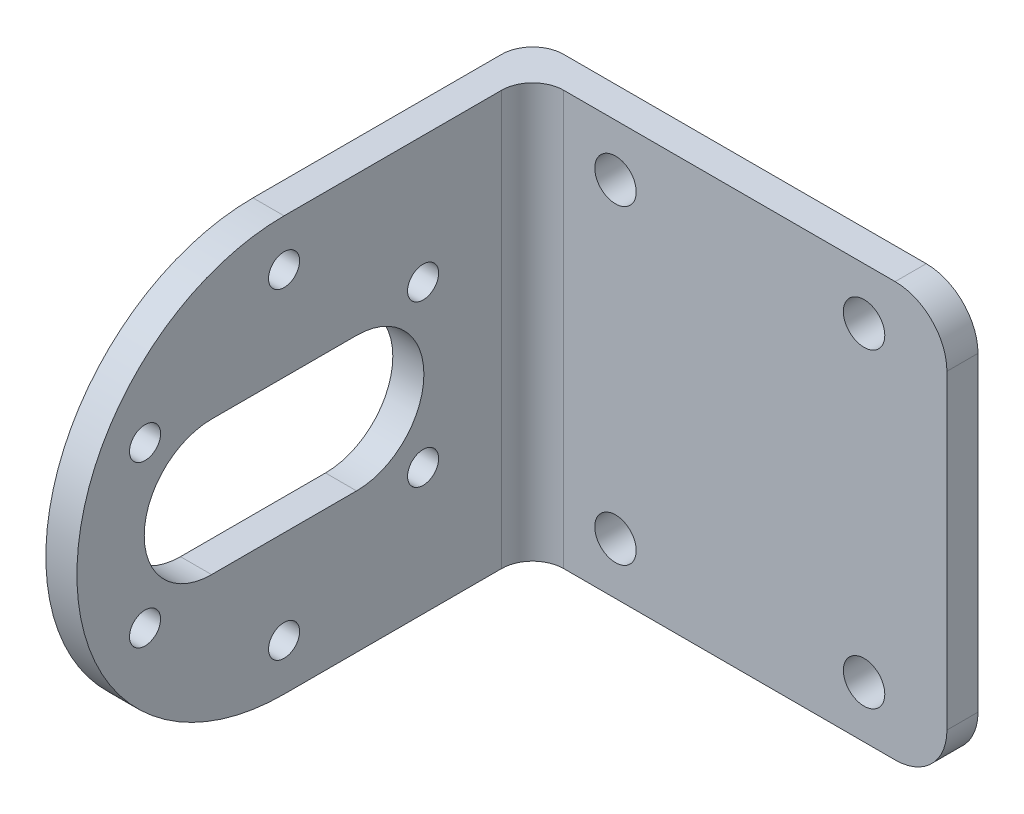
ISO-10303-21;
HEADER;
FILE_DESCRIPTION(('STEP AP214'),'2;1');
FILE_NAME('part.step','',(''),(''),'','','');
FILE_SCHEMA(('AUTOMOTIVE_DESIGN { 1 0 10303 214 1 1 1 1 }'));
ENDSEC;
DATA;
#1=APPLICATION_CONTEXT('core data for automotive mechanical design processes');
#2=APPLICATION_PROTOCOL_DEFINITION('international standard','automotive_design',2000,#1);
#3=PRODUCT_CONTEXT('',#1,'mechanical');
#4=PRODUCT('Part','Part','',(#3));
#5=PRODUCT_RELATED_PRODUCT_CATEGORY('part','',(#4));
#6=PRODUCT_DEFINITION_FORMATION('','',#4);
#7=PRODUCT_DEFINITION_CONTEXT('part definition',#1,'design');
#8=PRODUCT_DEFINITION('design','',#6,#7);
#9=PRODUCT_DEFINITION_SHAPE('','',#8);
#10=(LENGTH_UNIT() NAMED_UNIT(*) SI_UNIT(.MILLI.,.METRE.));
#11=(NAMED_UNIT(*) PLANE_ANGLE_UNIT() SI_UNIT($,.RADIAN.));
#12=(NAMED_UNIT(*) SI_UNIT($,.STERADIAN.) SOLID_ANGLE_UNIT());
#13=UNCERTAINTY_MEASURE_WITH_UNIT(LENGTH_MEASURE(1.E-05),#10,'distance_accuracy_value','');
#14=(GEOMETRIC_REPRESENTATION_CONTEXT(3) GLOBAL_UNCERTAINTY_ASSIGNED_CONTEXT((#13)) GLOBAL_UNIT_ASSIGNED_CONTEXT((#10,
#11,#12)) REPRESENTATION_CONTEXT('',''));
#15=CARTESIAN_POINT('',(0.,0.,0.));
#16=DIRECTION('',(0.,0.,1.));
#17=DIRECTION('',(1.,0.,0.));
#18=AXIS2_PLACEMENT_3D('',#15,#16,#17);
#19=CARTESIAN_POINT('',(0.,0.,3.));
#20=DIRECTION('',(0.,0.,-1.));
#21=DIRECTION('',(-1.,0.,0.));
#22=AXIS2_PLACEMENT_3D('',#19,#20,#21);
#23=PLANE('',#22);
#24=DIRECTION('',(-1.,0.,0.));
#25=VECTOR('',#24,1.);
#26=CARTESIAN_POINT('',(0.,40.,3.));
#27=LINE('',#26,#25);
#28=CARTESIAN_POINT('',(35.,40.,3.));
#29=VERTEX_POINT('',#28);
#30=CARTESIAN_POINT('',(3.,40.,3.));
#31=VERTEX_POINT('',#30);
#32=EDGE_CURVE('E480',#29,#31,#27,.T.);
#33=ORIENTED_EDGE('',*,*,#32,.T.);
#34=DIRECTION('',(0.,-1.,0.));
#35=VECTOR('',#34,1.);
#36=CARTESIAN_POINT('',(3.,0.,3.));
#37=LINE('',#36,#35);
#38=CARTESIAN_POINT('',(3.,0.,3.));
#39=VERTEX_POINT('',#38);
#40=EDGE_CURVE('E533',#31,#39,#37,.T.);
#41=ORIENTED_EDGE('',*,*,#40,.T.);
#42=DIRECTION('',(1.,0.,0.));
#43=VECTOR('',#42,1.);
#44=CARTESIAN_POINT('',(0.,0.,3.));
#45=LINE('',#44,#43);
#46=CARTESIAN_POINT('',(35.,0.,3.));
#47=VERTEX_POINT('',#46);
#48=EDGE_CURVE('E472',#39,#47,#45,.T.);
#49=ORIENTED_EDGE('',*,*,#48,.T.);
#50=CARTESIAN_POINT('',(35.,5.,3.));
#51=DIRECTION('',(0.,0.,-1.));
#52=DIRECTION('',(-1.,0.,0.));
#53=AXIS2_PLACEMENT_3D('',#50,#51,#52);
#54=CIRCLE('',#53,5.);
#55=CARTESIAN_POINT('',(40.,5.,3.));
#56=VERTEX_POINT('',#55);
#57=EDGE_CURVE('E513',#47,#56,#54,.F.);
#58=ORIENTED_EDGE('',*,*,#57,.T.);
#59=DIRECTION('',(0.,1.,0.));
#60=VECTOR('',#59,1.);
#61=CARTESIAN_POINT('',(40.,0.,3.));
#62=LINE('',#61,#60);
#63=CARTESIAN_POINT('',(40.,35.,3.));
#64=VERTEX_POINT('',#63);
#65=EDGE_CURVE('E475',#56,#64,#62,.T.);
#66=ORIENTED_EDGE('',*,*,#65,.T.);
#67=CARTESIAN_POINT('',(35.,35.,3.));
#68=DIRECTION('',(0.,0.,-1.));
#69=DIRECTION('',(-1.,0.,0.));
#70=AXIS2_PLACEMENT_3D('',#67,#68,#69);
#71=CIRCLE('',#70,5.);
#72=EDGE_CURVE('E510',#64,#29,#71,.F.);
#73=ORIENTED_EDGE('',*,*,#72,.T.);
#74=EDGE_LOOP('',(#33,#41,#49,#58,#66,#73));
#75=FACE_BOUND('',#74,.T.);
#76=CARTESIAN_POINT('',(32.,35.,3.));
#77=DIRECTION('',(0.,0.,1.));
#78=DIRECTION('',(1.,0.,0.));
#79=AXIS2_PLACEMENT_3D('',#76,#77,#78);
#80=CIRCLE('',#79,2.);
#81=CARTESIAN_POINT('',(34.,35.,3.));
#82=VERTEX_POINT('',#81);
#83=EDGE_CURVE('E464',#82,#82,#80,.T.);
#84=ORIENTED_EDGE('',*,*,#83,.F.);
#85=EDGE_LOOP('',(#84));
#86=FACE_BOUND('',#85,.T.);
#87=CARTESIAN_POINT('',(32.,5.,3.));
#88=DIRECTION('',(0.,0.,1.));
#89=DIRECTION('',(1.,0.,0.));
#90=AXIS2_PLACEMENT_3D('',#87,#88,#89);
#91=CIRCLE('',#90,2.);
#92=CARTESIAN_POINT('',(34.,5.,3.));
#93=VERTEX_POINT('',#92);
#94=EDGE_CURVE('E456',#93,#93,#91,.T.);
#95=ORIENTED_EDGE('',*,*,#94,.F.);
#96=EDGE_LOOP('',(#95));
#97=FACE_BOUND('',#96,.T.);
#98=CARTESIAN_POINT('',(8.,35.,3.));
#99=DIRECTION('',(0.,0.,1.));
#100=DIRECTION('',(1.,0.,0.));
#101=AXIS2_PLACEMENT_3D('',#98,#99,#100);
#102=CIRCLE('',#101,2.);
#103=CARTESIAN_POINT('',(10.,35.,3.));
#104=VERTEX_POINT('',#103);
#105=EDGE_CURVE('E448',#104,#104,#102,.T.);
#106=ORIENTED_EDGE('',*,*,#105,.F.);
#107=EDGE_LOOP('',(#106));
#108=FACE_BOUND('',#107,.T.);
#109=CARTESIAN_POINT('',(7.99999999999999,5.,3.));
#110=DIRECTION('',(0.,0.,1.));
#111=DIRECTION('',(1.,0.,0.));
#112=AXIS2_PLACEMENT_3D('',#109,#110,#111);
#113=CIRCLE('',#112,2.);
#114=CARTESIAN_POINT('',(9.99999999999999,5.,3.));
#115=VERTEX_POINT('',#114);
#116=EDGE_CURVE('E440',#115,#115,#113,.T.);
#117=ORIENTED_EDGE('',*,*,#116,.F.);
#118=EDGE_LOOP('',(#117));
#119=FACE_BOUND('',#118,.T.);
#120=ADVANCED_FACE('F213',(#75,#86,#97,#108,#119),#23,.F.);
#121=CARTESIAN_POINT('',(0.,0.,0.));
#122=DIRECTION('',(0.,0.,-1.));
#123=DIRECTION('',(-1.,0.,0.));
#124=AXIS2_PLACEMENT_3D('',#121,#122,#123);
#125=PLANE('',#124);
#126=CARTESIAN_POINT('',(8.,35.,0.));
#127=DIRECTION('',(0.,0.,1.));
#128=DIRECTION('',(1.,0.,0.));
#129=AXIS2_PLACEMENT_3D('',#126,#127,#128);
#130=CIRCLE('',#129,2.);
#131=CARTESIAN_POINT('',(10.,35.,0.));
#132=VERTEX_POINT('',#131);
#133=EDGE_CURVE('E444',#132,#132,#130,.T.);
#134=ORIENTED_EDGE('',*,*,#133,.T.);
#135=EDGE_LOOP('',(#134));
#136=FACE_BOUND('',#135,.T.);
#137=CARTESIAN_POINT('',(32.,35.,0.));
#138=DIRECTION('',(0.,0.,1.));
#139=DIRECTION('',(1.,0.,0.));
#140=AXIS2_PLACEMENT_3D('',#137,#138,#139);
#141=CIRCLE('',#140,2.);
#142=CARTESIAN_POINT('',(34.,35.,0.));
#143=VERTEX_POINT('',#142);
#144=EDGE_CURVE('E460',#143,#143,#141,.T.);
#145=ORIENTED_EDGE('',*,*,#144,.T.);
#146=EDGE_LOOP('',(#145));
#147=FACE_BOUND('',#146,.T.);
#148=DIRECTION('',(1.,0.,0.));
#149=VECTOR('',#148,1.);
#150=CARTESIAN_POINT('',(0.,0.,0.));
#151=LINE('',#150,#149);
#152=CARTESIAN_POINT('',(0.,0.,0.));
#153=VERTEX_POINT('',#152);
#154=CARTESIAN_POINT('',(35.,0.,0.));
#155=VERTEX_POINT('',#154);
#156=EDGE_CURVE('E468',#153,#155,#151,.T.);
#157=ORIENTED_EDGE('',*,*,#156,.F.);
#158=DIRECTION('',(0.,-1.,0.));
#159=VECTOR('',#158,1.);
#160=CARTESIAN_POINT('',(0.,0.,0.));
#161=LINE('',#160,#159);
#162=CARTESIAN_POINT('',(0.,40.,0.));
#163=VERTEX_POINT('',#162);
#164=EDGE_CURVE('E527',#153,#163,#161,.F.);
#165=ORIENTED_EDGE('',*,*,#164,.T.);
#166=DIRECTION('',(-1.,0.,0.));
#167=VECTOR('',#166,1.);
#168=CARTESIAN_POINT('',(0.,40.,0.));
#169=LINE('',#168,#167);
#170=CARTESIAN_POINT('',(35.,40.,0.));
#171=VERTEX_POINT('',#170);
#172=EDGE_CURVE('E476',#171,#163,#169,.T.);
#173=ORIENTED_EDGE('',*,*,#172,.F.);
#174=CARTESIAN_POINT('',(35.,35.,0.));
#175=DIRECTION('',(0.,0.,-1.));
#176=DIRECTION('',(-1.,0.,0.));
#177=AXIS2_PLACEMENT_3D('',#174,#175,#176);
#178=CIRCLE('',#177,5.);
#179=CARTESIAN_POINT('',(40.,35.,0.));
#180=VERTEX_POINT('',#179);
#181=EDGE_CURVE('E499',#171,#180,#178,.T.);
#182=ORIENTED_EDGE('',*,*,#181,.T.);
#183=DIRECTION('',(0.,1.,0.));
#184=VECTOR('',#183,1.);
#185=CARTESIAN_POINT('',(40.,0.,0.));
#186=LINE('',#185,#184);
#187=CARTESIAN_POINT('',(40.,5.,0.));
#188=VERTEX_POINT('',#187);
#189=EDGE_CURVE('E486',#188,#180,#186,.T.);
#190=ORIENTED_EDGE('',*,*,#189,.F.);
#191=CARTESIAN_POINT('',(35.,5.,0.));
#192=DIRECTION('',(0.,0.,-1.));
#193=DIRECTION('',(-1.,0.,0.));
#194=AXIS2_PLACEMENT_3D('',#191,#192,#193);
#195=CIRCLE('',#194,5.);
#196=EDGE_CURVE('E502',#188,#155,#195,.T.);
#197=ORIENTED_EDGE('',*,*,#196,.T.);
#198=EDGE_LOOP('',(#157,#165,#173,#182,#190,#197));
#199=FACE_BOUND('',#198,.T.);
#200=CARTESIAN_POINT('',(32.,5.,0.));
#201=DIRECTION('',(0.,0.,1.));
#202=DIRECTION('',(1.,0.,0.));
#203=AXIS2_PLACEMENT_3D('',#200,#201,#202);
#204=CIRCLE('',#203,2.);
#205=CARTESIAN_POINT('',(34.,5.,0.));
#206=VERTEX_POINT('',#205);
#207=EDGE_CURVE('E452',#206,#206,#204,.T.);
#208=ORIENTED_EDGE('',*,*,#207,.T.);
#209=EDGE_LOOP('',(#208));
#210=FACE_BOUND('',#209,.T.);
#211=CARTESIAN_POINT('',(7.99999999999999,5.,0.));
#212=DIRECTION('',(0.,0.,1.));
#213=DIRECTION('',(1.,0.,0.));
#214=AXIS2_PLACEMENT_3D('',#211,#212,#213);
#215=CIRCLE('',#214,2.);
#216=CARTESIAN_POINT('',(9.99999999999999,5.,0.));
#217=VERTEX_POINT('',#216);
#218=EDGE_CURVE('E439',#217,#217,#215,.T.);
#219=ORIENTED_EDGE('',*,*,#218,.T.);
#220=EDGE_LOOP('',(#219));
#221=FACE_BOUND('',#220,.T.);
#222=ADVANCED_FACE('F561',(#136,#147,#199,#210,#221),#125,.T.);
#223=CARTESIAN_POINT('',(0.,0.,3.));
#224=DIRECTION('',(0.,1.,0.));
#225=DIRECTION('',(0.,0.,1.));
#226=AXIS2_PLACEMENT_3D('',#223,#224,#225);
#227=PLANE('',#226);
#228=DIRECTION('',(0.,0.,1.));
#229=VECTOR('',#228,1.);
#230=CARTESIAN_POINT('',(-3.,0.,0.));
#231=LINE('',#230,#229);
#232=CARTESIAN_POINT('',(-3.,0.,3.));
#233=VERTEX_POINT('',#232);
#234=CARTESIAN_POINT('',(-3.,0.,27.));
#235=VERTEX_POINT('',#234);
#236=EDGE_CURVE('E412',#233,#235,#231,.T.);
#237=ORIENTED_EDGE('',*,*,#236,.F.);
#238=CARTESIAN_POINT('',(0.,0.,3.));
#239=DIRECTION('',(0.,1.,0.));
#240=DIRECTION('',(0.,0.,1.));
#241=AXIS2_PLACEMENT_3D('',#238,#239,#240);
#242=CIRCLE('',#241,3.);
#243=EDGE_CURVE('E524',#233,#153,#242,.F.);
#244=ORIENTED_EDGE('',*,*,#243,.T.);
#245=ORIENTED_EDGE('',*,*,#156,.T.);
#246=DIRECTION('',(0.,0.,-1.));
#247=VECTOR('',#246,1.);
#248=CARTESIAN_POINT('',(35.,0.,3.));
#249=LINE('',#248,#247);
#250=EDGE_CURVE('E506',#155,#47,#249,.F.);
#251=ORIENTED_EDGE('',*,*,#250,.T.);
#252=ORIENTED_EDGE('',*,*,#48,.F.);
#253=CARTESIAN_POINT('',(3.,0.,6.));
#254=DIRECTION('',(0.,1.,0.));
#255=DIRECTION('',(0.,0.,1.));
#256=AXIS2_PLACEMENT_3D('',#253,#254,#255);
#257=CIRCLE('',#256,3.);
#258=CARTESIAN_POINT('',(0.,0.,6.));
#259=VERTEX_POINT('',#258);
#260=EDGE_CURVE('E222',#39,#259,#257,.T.);
#261=ORIENTED_EDGE('',*,*,#260,.T.);
#262=DIRECTION('',(0.,0.,1.));
#263=VECTOR('',#262,1.);
#264=CARTESIAN_POINT('',(0.,0.,0.));
#265=LINE('',#264,#263);
#266=CARTESIAN_POINT('',(0.,0.,27.));
#267=VERTEX_POINT('',#266);
#268=EDGE_CURVE('E408',#259,#267,#265,.T.);
#269=ORIENTED_EDGE('',*,*,#268,.T.);
#270=DIRECTION('',(1.,0.,0.));
#271=VECTOR('',#270,1.);
#272=CARTESIAN_POINT('',(-3.,0.,27.));
#273=LINE('',#272,#271);
#274=EDGE_CURVE('E435',#235,#267,#273,.T.);
#275=ORIENTED_EDGE('',*,*,#274,.F.);
#276=EDGE_LOOP('',(#237,#244,#245,#251,#252,#261,#269,#275));
#277=FACE_BOUND('',#276,.T.);
#278=ADVANCED_FACE('F542',(#277),#227,.F.);
#279=CARTESIAN_POINT('',(40.,0.,3.));
#280=DIRECTION('',(-1.,0.,0.));
#281=DIRECTION('',(0.,0.,1.));
#282=AXIS2_PLACEMENT_3D('',#279,#280,#281);
#283=PLANE('',#282);
#284=ORIENTED_EDGE('',*,*,#65,.F.);
#285=DIRECTION('',(0.,0.,-1.));
#286=VECTOR('',#285,1.);
#287=CARTESIAN_POINT('',(40.,5.,3.));
#288=LINE('',#287,#286);
#289=EDGE_CURVE('E495',#56,#188,#288,.T.);
#290=ORIENTED_EDGE('',*,*,#289,.T.);
#291=ORIENTED_EDGE('',*,*,#189,.T.);
#292=DIRECTION('',(0.,0.,-1.));
#293=VECTOR('',#292,1.);
#294=CARTESIAN_POINT('',(40.,35.,3.));
#295=LINE('',#294,#293);
#296=EDGE_CURVE('E483',#180,#64,#295,.F.);
#297=ORIENTED_EDGE('',*,*,#296,.T.);
#298=EDGE_LOOP('',(#284,#290,#291,#297));
#299=FACE_BOUND('',#298,.T.);
#300=ADVANCED_FACE('F565',(#299),#283,.F.);
#301=CARTESIAN_POINT('',(0.,40.,3.));
#302=DIRECTION('',(0.,-1.,0.));
#303=DIRECTION('',(0.,0.,-1.));
#304=AXIS2_PLACEMENT_3D('',#301,#302,#303);
#305=PLANE('',#304);
#306=ORIENTED_EDGE('',*,*,#172,.T.);
#307=CARTESIAN_POINT('',(0.,40.,3.));
#308=DIRECTION('',(0.,-1.,0.));
#309=DIRECTION('',(0.,0.,-1.));
#310=AXIS2_PLACEMENT_3D('',#307,#308,#309);
#311=CIRCLE('',#310,3.);
#312=CARTESIAN_POINT('',(-3.,40.,3.));
#313=VERTEX_POINT('',#312);
#314=EDGE_CURVE('E530',#163,#313,#311,.F.);
#315=ORIENTED_EDGE('',*,*,#314,.T.);
#316=DIRECTION('',(0.,0.,1.));
#317=VECTOR('',#316,1.);
#318=CARTESIAN_POINT('',(-3.,40.,0.));
#319=LINE('',#318,#317);
#320=CARTESIAN_POINT('',(-3.,40.,27.));
#321=VERTEX_POINT('',#320);
#322=EDGE_CURVE('E420',#313,#321,#319,.T.);
#323=ORIENTED_EDGE('',*,*,#322,.T.);
#324=DIRECTION('',(1.,0.,0.));
#325=VECTOR('',#324,1.);
#326=CARTESIAN_POINT('',(-3.,40.,27.));
#327=LINE('',#326,#325);
#328=CARTESIAN_POINT('',(0.,40.,27.));
#329=VERTEX_POINT('',#328);
#330=EDGE_CURVE('E423',#321,#329,#327,.T.);
#331=ORIENTED_EDGE('',*,*,#330,.T.);
#332=DIRECTION('',(0.,0.,1.));
#333=VECTOR('',#332,1.);
#334=CARTESIAN_POINT('',(0.,40.,0.));
#335=LINE('',#334,#333);
#336=CARTESIAN_POINT('',(0.,40.,6.));
#337=VERTEX_POINT('',#336);
#338=EDGE_CURVE('E416',#337,#329,#335,.T.);
#339=ORIENTED_EDGE('',*,*,#338,.F.);
#340=CARTESIAN_POINT('',(3.,40.,6.));
#341=DIRECTION('',(0.,-1.,0.));
#342=DIRECTION('',(0.,0.,-1.));
#343=AXIS2_PLACEMENT_3D('',#340,#341,#342);
#344=CIRCLE('',#343,3.);
#345=EDGE_CURVE('E12',#337,#31,#344,.T.);
#346=ORIENTED_EDGE('',*,*,#345,.T.);
#347=ORIENTED_EDGE('',*,*,#32,.F.);
#348=DIRECTION('',(0.,0.,-1.));
#349=VECTOR('',#348,1.);
#350=CARTESIAN_POINT('',(35.,40.,3.));
#351=LINE('',#350,#349);
#352=EDGE_CURVE('E516',#29,#171,#351,.T.);
#353=ORIENTED_EDGE('',*,*,#352,.T.);
#354=EDGE_LOOP('',(#306,#315,#323,#331,#339,#346,#347,#353));
#355=FACE_BOUND('',#354,.T.);
#356=ADVANCED_FACE('F553',(#355),#305,.F.);
#357=CARTESIAN_POINT('',(32.,35.,3.));
#358=DIRECTION('',(0.,0.,-1.));
#359=DIRECTION('',(-1.,0.,0.));
#360=AXIS2_PLACEMENT_3D('',#357,#358,#359);
#361=CYLINDRICAL_SURFACE('',#360,2.);
#362=ORIENTED_EDGE('',*,*,#83,.T.);
#363=EDGE_LOOP('',(#362));
#364=FACE_BOUND('',#363,.T.);
#365=ORIENTED_EDGE('',*,*,#144,.F.);
#366=EDGE_LOOP('',(#365));
#367=FACE_BOUND('',#366,.T.);
#368=ADVANCED_FACE('F603',(#364,#367),#361,.F.);
#369=CARTESIAN_POINT('',(32.,5.,3.));
#370=DIRECTION('',(0.,0.,-1.));
#371=DIRECTION('',(-1.,0.,0.));
#372=AXIS2_PLACEMENT_3D('',#369,#370,#371);
#373=CYLINDRICAL_SURFACE('',#372,2.);
#374=ORIENTED_EDGE('',*,*,#94,.T.);
#375=EDGE_LOOP('',(#374));
#376=FACE_BOUND('',#375,.T.);
#377=ORIENTED_EDGE('',*,*,#207,.F.);
#378=EDGE_LOOP('',(#377));
#379=FACE_BOUND('',#378,.T.);
#380=ADVANCED_FACE('F767',(#376,#379),#373,.F.);
#381=CARTESIAN_POINT('',(8.,35.,3.));
#382=DIRECTION('',(0.,0.,-1.));
#383=DIRECTION('',(-1.,0.,0.));
#384=AXIS2_PLACEMENT_3D('',#381,#382,#383);
#385=CYLINDRICAL_SURFACE('',#384,2.);
#386=ORIENTED_EDGE('',*,*,#105,.T.);
#387=EDGE_LOOP('',(#386));
#388=FACE_BOUND('',#387,.T.);
#389=ORIENTED_EDGE('',*,*,#133,.F.);
#390=EDGE_LOOP('',(#389));
#391=FACE_BOUND('',#390,.T.);
#392=ADVANCED_FACE('F758',(#388,#391),#385,.F.);
#393=CARTESIAN_POINT('',(7.99999999999999,5.,3.));
#394=DIRECTION('',(0.,0.,-1.));
#395=DIRECTION('',(-1.,0.,0.));
#396=AXIS2_PLACEMENT_3D('',#393,#394,#395);
#397=CYLINDRICAL_SURFACE('',#396,2.);
#398=ORIENTED_EDGE('',*,*,#116,.T.);
#399=EDGE_LOOP('',(#398));
#400=FACE_BOUND('',#399,.T.);
#401=ORIENTED_EDGE('',*,*,#218,.F.);
#402=EDGE_LOOP('',(#401));
#403=FACE_BOUND('',#402,.T.);
#404=ADVANCED_FACE('F614',(#400,#403),#397,.F.);
#405=CARTESIAN_POINT('',(35.,5.,3.));
#406=DIRECTION('',(0.,0.,-1.));
#407=DIRECTION('',(-1.,0.,0.));
#408=AXIS2_PLACEMENT_3D('',#405,#406,#407);
#409=CYLINDRICAL_SURFACE('',#408,5.);
#410=ORIENTED_EDGE('',*,*,#57,.F.);
#411=ORIENTED_EDGE('',*,*,#250,.F.);
#412=ORIENTED_EDGE('',*,*,#196,.F.);
#413=ORIENTED_EDGE('',*,*,#289,.F.);
#414=EDGE_LOOP('',(#410,#411,#412,#413));
#415=FACE_BOUND('',#414,.T.);
#416=ADVANCED_FACE('F569',(#415),#409,.T.);
#417=CARTESIAN_POINT('',(35.,35.,3.));
#418=DIRECTION('',(0.,0.,-1.));
#419=DIRECTION('',(-1.,0.,0.));
#420=AXIS2_PLACEMENT_3D('',#417,#418,#419);
#421=CYLINDRICAL_SURFACE('',#420,5.);
#422=ORIENTED_EDGE('',*,*,#72,.F.);
#423=ORIENTED_EDGE('',*,*,#296,.F.);
#424=ORIENTED_EDGE('',*,*,#181,.F.);
#425=ORIENTED_EDGE('',*,*,#352,.F.);
#426=EDGE_LOOP('',(#422,#423,#424,#425));
#427=FACE_BOUND('',#426,.T.);
#428=ADVANCED_FACE('F556',(#427),#421,.T.);
#429=CARTESIAN_POINT('',(-3.,20.,27.));
#430=DIRECTION('',(-1.,0.,0.));
#431=DIRECTION('',(0.,0.,1.));
#432=AXIS2_PLACEMENT_3D('',#429,#430,#431);
#433=PLANE('',#432);
#434=CARTESIAN_POINT('',(-3.,20.,34.));
#435=DIRECTION('',(-1.,0.,0.));
#436=DIRECTION('',(0.,0.,1.));
#437=AXIS2_PLACEMENT_3D('',#434,#435,#436);
#438=CIRCLE('',#437,6.49999999999983);
#439=CARTESIAN_POINT('',(-3.,13.5,34.));
#440=VERTEX_POINT('',#439);
#441=CARTESIAN_POINT('',(-3.,26.4999999999997,34.));
#442=VERTEX_POINT('',#441);
#443=EDGE_CURVE('E327',#440,#442,#438,.T.);
#444=ORIENTED_EDGE('',*,*,#443,.F.);
#445=DIRECTION('',(0.,0.,1.));
#446=VECTOR('',#445,1.);
#447=CARTESIAN_POINT('',(-3.,13.5,0.));
#448=LINE('',#447,#446);
#449=CARTESIAN_POINT('',(-3.,13.5,20.));
#450=VERTEX_POINT('',#449);
#451=EDGE_CURVE('E316',#450,#440,#448,.T.);
#452=ORIENTED_EDGE('',*,*,#451,.F.);
#453=CARTESIAN_POINT('',(-3.,20.,20.));
#454=DIRECTION('',(-1.,0.,0.));
#455=DIRECTION('',(0.,0.,1.));
#456=AXIS2_PLACEMENT_3D('',#453,#454,#455);
#457=CIRCLE('',#456,6.49999999999998);
#458=CARTESIAN_POINT('',(-3.,26.5,20.));
#459=VERTEX_POINT('',#458);
#460=EDGE_CURVE('E346',#459,#450,#457,.T.);
#461=ORIENTED_EDGE('',*,*,#460,.F.);
#462=DIRECTION('',(0.,0.,1.));
#463=VECTOR('',#462,1.);
#464=CARTESIAN_POINT('',(-3.,26.5000000000004,5.64776400250171E-13));
#465=LINE('',#464,#463);
#466=EDGE_CURVE('E342',#459,#442,#465,.T.);
#467=ORIENTED_EDGE('',*,*,#466,.T.);
#468=EDGE_LOOP('',(#444,#452,#461,#467));
#469=FACE_BOUND('',#468,.T.);
#470=CARTESIAN_POINT('',(-3.,35.5,27.));
#471=DIRECTION('',(-1.,0.,0.));
#472=DIRECTION('',(0.,0.,1.));
#473=AXIS2_PLACEMENT_3D('',#470,#471,#472);
#474=CIRCLE('',#473,1.5);
#475=CARTESIAN_POINT('',(-3.,35.5,28.5));
#476=VERTEX_POINT('',#475);
#477=EDGE_CURVE('E372',#476,#476,#474,.T.);
#478=ORIENTED_EDGE('',*,*,#477,.F.);
#479=EDGE_LOOP('',(#478));
#480=FACE_BOUND('',#479,.T.);
#481=CARTESIAN_POINT('',(-3.,27.7499999999987,13.5766062413421));
#482=DIRECTION('',(-1.,0.,0.));
#483=DIRECTION('',(0.,0.,1.));
#484=AXIS2_PLACEMENT_3D('',#481,#482,#483);
#485=CIRCLE('',#484,1.5);
#486=CARTESIAN_POINT('',(-3.,27.7499999999987,15.0766062413421));
#487=VERTEX_POINT('',#486);
#488=EDGE_CURVE('E388',#487,#487,#485,.T.);
#489=ORIENTED_EDGE('',*,*,#488,.F.);
#490=EDGE_LOOP('',(#489));
#491=FACE_BOUND('',#490,.T.);
#492=CARTESIAN_POINT('',(-3.,12.2500000000014,40.4233937586612));
#493=DIRECTION('',(-1.,0.,0.));
#494=DIRECTION('',(0.,0.,1.));
#495=AXIS2_PLACEMENT_3D('',#492,#493,#494);
#496=CIRCLE('',#495,1.5);
#497=CARTESIAN_POINT('',(-3.,12.2500000000014,41.9233937586612));
#498=VERTEX_POINT('',#497);
#499=EDGE_CURVE('E404',#498,#498,#496,.T.);
#500=ORIENTED_EDGE('',*,*,#499,.F.);
#501=EDGE_LOOP('',(#500));
#502=FACE_BOUND('',#501,.T.);
#503=ORIENTED_EDGE('',*,*,#322,.F.);
#504=DIRECTION('',(0.,-1.,0.));
#505=VECTOR('',#504,1.);
#506=CARTESIAN_POINT('',(-3.,20.,3.));
#507=LINE('',#506,#505);
#508=EDGE_CURVE('E520',#313,#233,#507,.T.);
#509=ORIENTED_EDGE('',*,*,#508,.T.);
#510=ORIENTED_EDGE('',*,*,#236,.T.);
#511=CARTESIAN_POINT('',(-3.,20.,27.));
#512=DIRECTION('',(-1.,0.,0.));
#513=DIRECTION('',(0.,0.,1.));
#514=AXIS2_PLACEMENT_3D('',#511,#512,#513);
#515=CIRCLE('',#514,20.);
#516=EDGE_CURVE('E415',#235,#321,#515,.T.);
#517=ORIENTED_EDGE('',*,*,#516,.T.);
#518=EDGE_LOOP('',(#503,#509,#510,#517));
#519=FACE_BOUND('',#518,.T.);
#520=CARTESIAN_POINT('',(-3.,4.5,27.0000000000032));
#521=DIRECTION('',(-1.,0.,0.));
#522=DIRECTION('',(0.,0.,1.));
#523=AXIS2_PLACEMENT_3D('',#520,#521,#522);
#524=CIRCLE('',#523,1.5);
#525=CARTESIAN_POINT('',(-3.,4.5,28.5000000000032));
#526=VERTEX_POINT('',#525);
#527=EDGE_CURVE('E396',#526,#526,#524,.T.);
#528=ORIENTED_EDGE('',*,*,#527,.F.);
#529=EDGE_LOOP('',(#528));
#530=FACE_BOUND('',#529,.T.);
#531=CARTESIAN_POINT('',(-3.,27.7500000000014,40.4233937586596));
#532=DIRECTION('',(-1.,0.,0.));
#533=DIRECTION('',(0.,0.,1.));
#534=AXIS2_PLACEMENT_3D('',#531,#532,#533);
#535=CIRCLE('',#534,1.5);
#536=CARTESIAN_POINT('',(-3.,27.7500000000014,41.9233937586596));
#537=VERTEX_POINT('',#536);
#538=EDGE_CURVE('E380',#537,#537,#535,.T.);
#539=ORIENTED_EDGE('',*,*,#538,.F.);
#540=EDGE_LOOP('',(#539));
#541=FACE_BOUND('',#540,.T.);
#542=CARTESIAN_POINT('',(-3.,12.2499999999987,13.5766062413436));
#543=DIRECTION('',(-1.,0.,0.));
#544=DIRECTION('',(0.,0.,1.));
#545=AXIS2_PLACEMENT_3D('',#542,#543,#544);
#546=CIRCLE('',#545,1.5);
#547=CARTESIAN_POINT('',(-3.,12.2499999999987,15.0766062413436));
#548=VERTEX_POINT('',#547);
#549=EDGE_CURVE('E355',#548,#548,#546,.T.);
#550=ORIENTED_EDGE('',*,*,#549,.F.);
#551=EDGE_LOOP('',(#550));
#552=FACE_BOUND('',#551,.T.);
#553=ADVANCED_FACE('F340',(#469,#480,#491,#502,#519,#530,#541,#552),#433,.T.);
#554=CARTESIAN_POINT('',(0.,20.,27.));
#555=DIRECTION('',(-1.,0.,0.));
#556=DIRECTION('',(0.,0.,1.));
#557=AXIS2_PLACEMENT_3D('',#554,#555,#556);
#558=PLANE('',#557);
#559=ORIENTED_EDGE('',*,*,#268,.F.);
#560=DIRECTION('',(0.,-1.,0.));
#561=VECTOR('',#560,1.);
#562=CARTESIAN_POINT('',(0.,40.,6.));
#563=LINE('',#562,#561);
#564=EDGE_CURVE('E229',#259,#337,#563,.F.);
#565=ORIENTED_EDGE('',*,*,#564,.T.);
#566=ORIENTED_EDGE('',*,*,#338,.T.);
#567=CARTESIAN_POINT('',(0.,20.,27.));
#568=DIRECTION('',(-1.,0.,0.));
#569=DIRECTION('',(0.,0.,1.));
#570=AXIS2_PLACEMENT_3D('',#567,#568,#569);
#571=CIRCLE('',#570,20.);
#572=EDGE_CURVE('E426',#267,#329,#571,.T.);
#573=ORIENTED_EDGE('',*,*,#572,.F.);
#574=EDGE_LOOP('',(#559,#565,#566,#573));
#575=FACE_BOUND('',#574,.T.);
#576=CARTESIAN_POINT('',(0.,35.5,27.));
#577=DIRECTION('',(-1.,0.,0.));
#578=DIRECTION('',(0.,0.,1.));
#579=AXIS2_PLACEMENT_3D('',#576,#577,#578);
#580=CIRCLE('',#579,1.5);
#581=CARTESIAN_POINT('',(0.,35.5,28.5));
#582=VERTEX_POINT('',#581);
#583=EDGE_CURVE('E336',#582,#582,#580,.T.);
#584=ORIENTED_EDGE('',*,*,#583,.T.);
#585=EDGE_LOOP('',(#584));
#586=FACE_BOUND('',#585,.T.);
#587=CARTESIAN_POINT('',(0.,27.7500000000014,40.4233937586596));
#588=DIRECTION('',(-1.,0.,0.));
#589=DIRECTION('',(0.,0.,1.));
#590=AXIS2_PLACEMENT_3D('',#587,#588,#589);
#591=CIRCLE('',#590,1.5);
#592=CARTESIAN_POINT('',(0.,27.7500000000014,41.9233937586596));
#593=VERTEX_POINT('',#592);
#594=EDGE_CURVE('E376',#593,#593,#591,.T.);
#595=ORIENTED_EDGE('',*,*,#594,.T.);
#596=EDGE_LOOP('',(#595));
#597=FACE_BOUND('',#596,.T.);
#598=CARTESIAN_POINT('',(0.,27.7499999999987,13.5766062413421));
#599=DIRECTION('',(-1.,0.,0.));
#600=DIRECTION('',(0.,0.,1.));
#601=AXIS2_PLACEMENT_3D('',#598,#599,#600);
#602=CIRCLE('',#601,1.5);
#603=CARTESIAN_POINT('',(0.,27.7499999999987,15.0766062413421));
#604=VERTEX_POINT('',#603);
#605=EDGE_CURVE('E384',#604,#604,#602,.T.);
#606=ORIENTED_EDGE('',*,*,#605,.T.);
#607=EDGE_LOOP('',(#606));
#608=FACE_BOUND('',#607,.T.);
#609=CARTESIAN_POINT('',(0.,4.5,27.0000000000032));
#610=DIRECTION('',(-1.,0.,0.));
#611=DIRECTION('',(0.,0.,1.));
#612=AXIS2_PLACEMENT_3D('',#609,#610,#611);
#613=CIRCLE('',#612,1.5);
#614=CARTESIAN_POINT('',(0.,4.5,28.5000000000032));
#615=VERTEX_POINT('',#614);
#616=EDGE_CURVE('E392',#615,#615,#613,.T.);
#617=ORIENTED_EDGE('',*,*,#616,.T.);
#618=EDGE_LOOP('',(#617));
#619=FACE_BOUND('',#618,.T.);
#620=CARTESIAN_POINT('',(0.,12.2500000000014,40.4233937586612));
#621=DIRECTION('',(-1.,0.,0.));
#622=DIRECTION('',(0.,0.,1.));
#623=AXIS2_PLACEMENT_3D('',#620,#621,#622);
#624=CIRCLE('',#623,1.5);
#625=CARTESIAN_POINT('',(0.,12.2500000000014,41.9233937586612));
#626=VERTEX_POINT('',#625);
#627=EDGE_CURVE('E400',#626,#626,#624,.T.);
#628=ORIENTED_EDGE('',*,*,#627,.T.);
#629=EDGE_LOOP('',(#628));
#630=FACE_BOUND('',#629,.T.);
#631=DIRECTION('',(0.,0.,1.));
#632=VECTOR('',#631,1.);
#633=CARTESIAN_POINT('',(0.,13.5,0.));
#634=LINE('',#633,#632);
#635=CARTESIAN_POINT('',(0.,13.5,20.));
#636=VERTEX_POINT('',#635);
#637=CARTESIAN_POINT('',(0.,13.5,34.));
#638=VERTEX_POINT('',#637);
#639=EDGE_CURVE('E352',#636,#638,#634,.T.);
#640=ORIENTED_EDGE('',*,*,#639,.T.);
#641=CARTESIAN_POINT('',(0.,20.,34.));
#642=DIRECTION('',(-1.,0.,0.));
#643=DIRECTION('',(0.,0.,1.));
#644=AXIS2_PLACEMENT_3D('',#641,#642,#643);
#645=CIRCLE('',#644,6.49999999999983);
#646=CARTESIAN_POINT('',(0.,26.4999999999997,34.));
#647=VERTEX_POINT('',#646);
#648=EDGE_CURVE('E334',#638,#647,#645,.T.);
#649=ORIENTED_EDGE('',*,*,#648,.T.);
#650=DIRECTION('',(0.,0.,1.));
#651=VECTOR('',#650,1.);
#652=CARTESIAN_POINT('',(0.,26.5000000000004,5.64776400250171E-13));
#653=LINE('',#652,#651);
#654=CARTESIAN_POINT('',(0.,26.5,20.));
#655=VERTEX_POINT('',#654);
#656=EDGE_CURVE('E358',#655,#647,#653,.T.);
#657=ORIENTED_EDGE('',*,*,#656,.F.);
#658=CARTESIAN_POINT('',(0.,20.,20.));
#659=DIRECTION('',(-1.,0.,0.));
#660=DIRECTION('',(0.,0.,1.));
#661=AXIS2_PLACEMENT_3D('',#658,#659,#660);
#662=CIRCLE('',#661,6.49999999999998);
#663=EDGE_CURVE('E328',#655,#636,#662,.T.);
#664=ORIENTED_EDGE('',*,*,#663,.T.);
#665=EDGE_LOOP('',(#640,#649,#657,#664));
#666=FACE_BOUND('',#665,.T.);
#667=CARTESIAN_POINT('',(0.,12.2499999999987,13.5766062413436));
#668=DIRECTION('',(-1.,0.,0.));
#669=DIRECTION('',(0.,0.,1.));
#670=AXIS2_PLACEMENT_3D('',#667,#668,#669);
#671=CIRCLE('',#670,1.5);
#672=CARTESIAN_POINT('',(0.,12.2499999999987,15.0766062413436));
#673=VERTEX_POINT('',#672);
#674=EDGE_CURVE('E882',#673,#673,#671,.T.);
#675=ORIENTED_EDGE('',*,*,#674,.T.);
#676=EDGE_LOOP('',(#675));
#677=FACE_BOUND('',#676,.T.);
#678=ADVANCED_FACE('F547',(#575,#586,#597,#608,#619,#630,#666,#677),#558,.F.);
#679=CARTESIAN_POINT('',(-3.,20.,27.));
#680=DIRECTION('',(1.,0.,0.));
#681=DIRECTION('',(0.,0.,-1.));
#682=AXIS2_PLACEMENT_3D('',#679,#680,#681);
#683=CYLINDRICAL_SURFACE('',#682,20.);
#684=ORIENTED_EDGE('',*,*,#572,.T.);
#685=ORIENTED_EDGE('',*,*,#330,.F.);
#686=ORIENTED_EDGE('',*,*,#516,.F.);
#687=ORIENTED_EDGE('',*,*,#274,.T.);
#688=EDGE_LOOP('',(#684,#685,#686,#687));
#689=FACE_BOUND('',#688,.T.);
#690=ADVANCED_FACE('F582',(#689),#683,.T.);
#691=CARTESIAN_POINT('',(-3.,12.2500000000014,40.4233937586612));
#692=DIRECTION('',(1.,0.,0.));
#693=DIRECTION('',(0.,0.,-1.));
#694=AXIS2_PLACEMENT_3D('',#691,#692,#693);
#695=CYLINDRICAL_SURFACE('',#694,1.5);
#696=ORIENTED_EDGE('',*,*,#499,.T.);
#697=EDGE_LOOP('',(#696));
#698=FACE_BOUND('',#697,.T.);
#699=ORIENTED_EDGE('',*,*,#627,.F.);
#700=EDGE_LOOP('',(#699));
#701=FACE_BOUND('',#700,.T.);
#702=ADVANCED_FACE('F584',(#698,#701),#695,.F.);
#703=CARTESIAN_POINT('',(-3.,4.5,27.0000000000032));
#704=DIRECTION('',(1.,0.,0.));
#705=DIRECTION('',(0.,0.,-1.));
#706=AXIS2_PLACEMENT_3D('',#703,#704,#705);
#707=CYLINDRICAL_SURFACE('',#706,1.5);
#708=ORIENTED_EDGE('',*,*,#527,.T.);
#709=EDGE_LOOP('',(#708));
#710=FACE_BOUND('',#709,.T.);
#711=ORIENTED_EDGE('',*,*,#616,.F.);
#712=EDGE_LOOP('',(#711));
#713=FACE_BOUND('',#712,.T.);
#714=ADVANCED_FACE('F590',(#710,#713),#707,.F.);
#715=CARTESIAN_POINT('',(-3.,27.7499999999987,13.5766062413421));
#716=DIRECTION('',(1.,0.,0.));
#717=DIRECTION('',(0.,0.,-1.));
#718=AXIS2_PLACEMENT_3D('',#715,#716,#717);
#719=CYLINDRICAL_SURFACE('',#718,1.5);
#720=ORIENTED_EDGE('',*,*,#488,.T.);
#721=EDGE_LOOP('',(#720));
#722=FACE_BOUND('',#721,.T.);
#723=ORIENTED_EDGE('',*,*,#605,.F.);
#724=EDGE_LOOP('',(#723));
#725=FACE_BOUND('',#724,.T.);
#726=ADVANCED_FACE('F648',(#722,#725),#719,.F.);
#727=CARTESIAN_POINT('',(-3.,27.7500000000014,40.4233937586596));
#728=DIRECTION('',(1.,0.,0.));
#729=DIRECTION('',(0.,0.,-1.));
#730=AXIS2_PLACEMENT_3D('',#727,#728,#729);
#731=CYLINDRICAL_SURFACE('',#730,1.5);
#732=ORIENTED_EDGE('',*,*,#538,.T.);
#733=EDGE_LOOP('',(#732));
#734=FACE_BOUND('',#733,.T.);
#735=ORIENTED_EDGE('',*,*,#594,.F.);
#736=EDGE_LOOP('',(#735));
#737=FACE_BOUND('',#736,.T.);
#738=ADVANCED_FACE('F644',(#734,#737),#731,.F.);
#739=CARTESIAN_POINT('',(-3.,35.5,27.));
#740=DIRECTION('',(1.,0.,0.));
#741=DIRECTION('',(0.,0.,-1.));
#742=AXIS2_PLACEMENT_3D('',#739,#740,#741);
#743=CYLINDRICAL_SURFACE('',#742,1.5);
#744=ORIENTED_EDGE('',*,*,#477,.T.);
#745=EDGE_LOOP('',(#744));
#746=FACE_BOUND('',#745,.T.);
#747=ORIENTED_EDGE('',*,*,#583,.F.);
#748=EDGE_LOOP('',(#747));
#749=FACE_BOUND('',#748,.T.);
#750=ADVANCED_FACE('F641',(#746,#749),#743,.F.);
#751=CARTESIAN_POINT('',(-3.,13.5,0.));
#752=DIRECTION('',(0.,1.,0.));
#753=DIRECTION('',(0.,0.,1.));
#754=AXIS2_PLACEMENT_3D('',#751,#752,#753);
#755=PLANE('',#754);
#756=ORIENTED_EDGE('',*,*,#639,.F.);
#757=DIRECTION('',(1.,0.,0.));
#758=VECTOR('',#757,1.);
#759=CARTESIAN_POINT('',(-3.,13.5,20.));
#760=LINE('',#759,#758);
#761=EDGE_CURVE('E322',#450,#636,#760,.T.);
#762=ORIENTED_EDGE('',*,*,#761,.F.);
#763=ORIENTED_EDGE('',*,*,#451,.T.);
#764=DIRECTION('',(1.,0.,0.));
#765=VECTOR('',#764,1.);
#766=CARTESIAN_POINT('',(-3.,13.5,34.));
#767=LINE('',#766,#765);
#768=EDGE_CURVE('E319',#440,#638,#767,.T.);
#769=ORIENTED_EDGE('',*,*,#768,.T.);
#770=EDGE_LOOP('',(#756,#762,#763,#769));
#771=FACE_BOUND('',#770,.T.);
#772=ADVANCED_FACE('F318',(#771),#755,.T.);
#773=CARTESIAN_POINT('',(-3.,20.,34.));
#774=DIRECTION('',(1.,0.,0.));
#775=DIRECTION('',(0.,0.,-1.));
#776=AXIS2_PLACEMENT_3D('',#773,#774,#775);
#777=CYLINDRICAL_SURFACE('',#776,6.49999999999983);
#778=ORIENTED_EDGE('',*,*,#648,.F.);
#779=ORIENTED_EDGE('',*,*,#768,.F.);
#780=ORIENTED_EDGE('',*,*,#443,.T.);
#781=DIRECTION('',(1.,0.,0.));
#782=VECTOR('',#781,1.);
#783=CARTESIAN_POINT('',(-3.,26.4999999999997,34.));
#784=LINE('',#783,#782);
#785=EDGE_CURVE('E337',#442,#647,#784,.T.);
#786=ORIENTED_EDGE('',*,*,#785,.T.);
#787=EDGE_LOOP('',(#778,#779,#780,#786));
#788=FACE_BOUND('',#787,.T.);
#789=ADVANCED_FACE('F331',(#788),#777,.F.);
#790=CARTESIAN_POINT('',(-3.,26.5000000000004,5.64776400250171E-13));
#791=DIRECTION('',(0.,1.,0.));
#792=DIRECTION('',(0.,0.,1.));
#793=AXIS2_PLACEMENT_3D('',#790,#791,#792);
#794=PLANE('',#793);
#795=ORIENTED_EDGE('',*,*,#656,.T.);
#796=ORIENTED_EDGE('',*,*,#785,.F.);
#797=ORIENTED_EDGE('',*,*,#466,.F.);
#798=DIRECTION('',(1.,0.,0.));
#799=VECTOR('',#798,1.);
#800=CARTESIAN_POINT('',(-3.,26.5,20.));
#801=LINE('',#800,#799);
#802=EDGE_CURVE('E367',#459,#655,#801,.T.);
#803=ORIENTED_EDGE('',*,*,#802,.T.);
#804=EDGE_LOOP('',(#795,#796,#797,#803));
#805=FACE_BOUND('',#804,.T.);
#806=ADVANCED_FACE('F628',(#805),#794,.F.);
#807=CARTESIAN_POINT('',(-3.,20.,20.));
#808=DIRECTION('',(1.,0.,0.));
#809=DIRECTION('',(0.,0.,-1.));
#810=AXIS2_PLACEMENT_3D('',#807,#808,#809);
#811=CYLINDRICAL_SURFACE('',#810,6.49999999999998);
#812=ORIENTED_EDGE('',*,*,#663,.F.);
#813=ORIENTED_EDGE('',*,*,#802,.F.);
#814=ORIENTED_EDGE('',*,*,#460,.T.);
#815=ORIENTED_EDGE('',*,*,#761,.T.);
#816=EDGE_LOOP('',(#812,#813,#814,#815));
#817=FACE_BOUND('',#816,.T.);
#818=ADVANCED_FACE('F622',(#817),#811,.F.);
#819=CARTESIAN_POINT('',(-3.,12.2499999999987,13.5766062413436));
#820=DIRECTION('',(1.,0.,0.));
#821=DIRECTION('',(0.,0.,-1.));
#822=AXIS2_PLACEMENT_3D('',#819,#820,#821);
#823=CYLINDRICAL_SURFACE('',#822,1.5);
#824=ORIENTED_EDGE('',*,*,#549,.T.);
#825=EDGE_LOOP('',(#824));
#826=FACE_BOUND('',#825,.T.);
#827=ORIENTED_EDGE('',*,*,#674,.F.);
#828=EDGE_LOOP('',(#827));
#829=FACE_BOUND('',#828,.T.);
#830=ADVANCED_FACE('F617',(#826,#829),#823,.F.);
#831=CARTESIAN_POINT('',(0.,20.,3.));
#832=DIRECTION('',(0.,-1.,0.));
#833=DIRECTION('',(0.,0.,-1.));
#834=AXIS2_PLACEMENT_3D('',#831,#832,#833);
#835=CYLINDRICAL_SURFACE('',#834,3.);
#836=ORIENTED_EDGE('',*,*,#314,.F.);
#837=ORIENTED_EDGE('',*,*,#164,.F.);
#838=ORIENTED_EDGE('',*,*,#243,.F.);
#839=ORIENTED_EDGE('',*,*,#508,.F.);
#840=EDGE_LOOP('',(#836,#837,#838,#839));
#841=FACE_BOUND('',#840,.T.);
#842=ADVANCED_FACE('F574',(#841),#835,.T.);
#843=CARTESIAN_POINT('',(3.,0.,6.));
#844=DIRECTION('',(0.,1.,0.));
#845=DIRECTION('',(0.,0.,1.));
#846=AXIS2_PLACEMENT_3D('',#843,#844,#845);
#847=CYLINDRICAL_SURFACE('',#846,3.);
#848=ORIENTED_EDGE('',*,*,#345,.F.);
#849=ORIENTED_EDGE('',*,*,#564,.F.);
#850=ORIENTED_EDGE('',*,*,#260,.F.);
#851=ORIENTED_EDGE('',*,*,#40,.F.);
#852=EDGE_LOOP('',(#848,#849,#850,#851));
#853=FACE_BOUND('',#852,.T.);
#854=ADVANCED_FACE('F215',(#853),#847,.F.);
#855=CLOSED_SHELL('',(#120,#222,#278,#300,#356,#368,#380,#392,#404,#416,#428,#553,#678,#690,
#702,#714,#726,#738,#750,#772,#789,#806,#818,#830,#842,#854));
#856=MANIFOLD_SOLID_BREP('B2',#855);
#857=ADVANCED_BREP_SHAPE_REPRESENTATION('',(#18,#856),#14);
#858=SHAPE_DEFINITION_REPRESENTATION(#9,#857);
ENDSEC;
END-ISO-10303-21;
